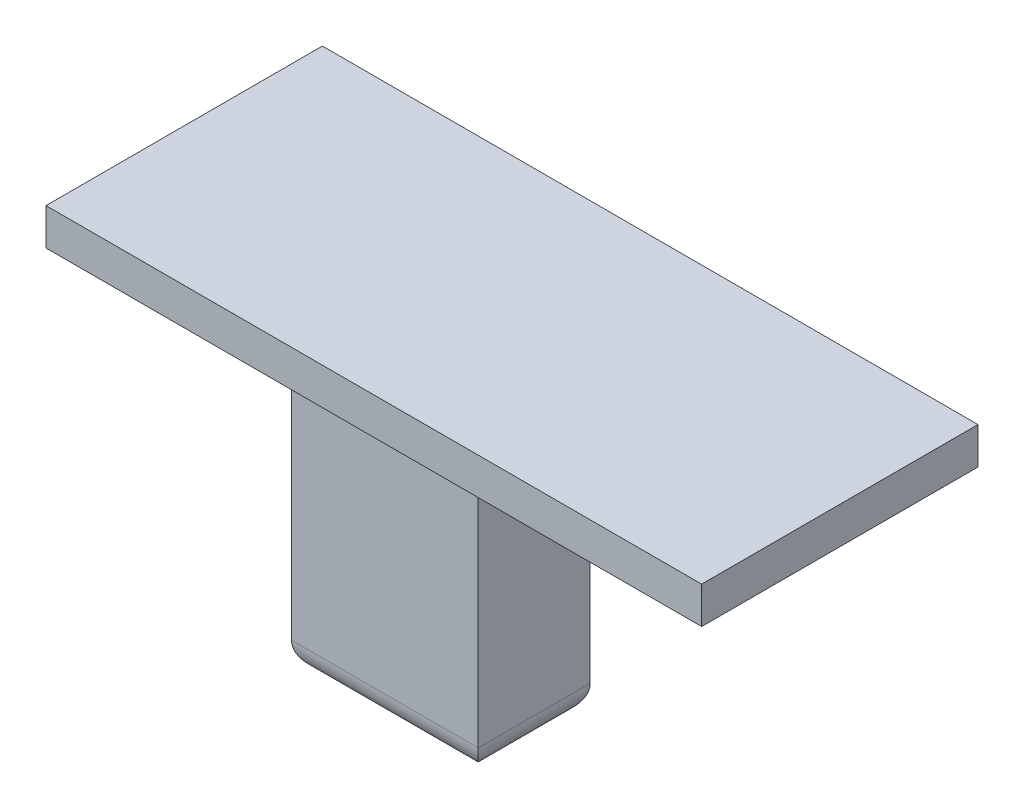
ISO-10303-21;
HEADER;
FILE_DESCRIPTION(('STEP AP214'),'2;1');
FILE_NAME('part.step','',(''),(''),'','','');
FILE_SCHEMA(('AUTOMOTIVE_DESIGN { 1 0 10303 214 1 1 1 1 }'));
ENDSEC;
DATA;
#1=APPLICATION_CONTEXT('core data for automotive mechanical design processes');
#2=APPLICATION_PROTOCOL_DEFINITION('international standard','automotive_design',2000,#1);
#3=PRODUCT_CONTEXT('',#1,'mechanical');
#4=PRODUCT('Part','Part','',(#3));
#5=PRODUCT_RELATED_PRODUCT_CATEGORY('part','',(#4));
#6=PRODUCT_DEFINITION_FORMATION('','',#4);
#7=PRODUCT_DEFINITION_CONTEXT('part definition',#1,'design');
#8=PRODUCT_DEFINITION('design','',#6,#7);
#9=PRODUCT_DEFINITION_SHAPE('','',#8);
#10=(LENGTH_UNIT() NAMED_UNIT(*) SI_UNIT(.MILLI.,.METRE.));
#11=(NAMED_UNIT(*) PLANE_ANGLE_UNIT() SI_UNIT($,.RADIAN.));
#12=(NAMED_UNIT(*) SI_UNIT($,.STERADIAN.) SOLID_ANGLE_UNIT());
#13=UNCERTAINTY_MEASURE_WITH_UNIT(LENGTH_MEASURE(1.E-05),#10,'distance_accuracy_value','');
#14=(GEOMETRIC_REPRESENTATION_CONTEXT(3) GLOBAL_UNCERTAINTY_ASSIGNED_CONTEXT((#13)) GLOBAL_UNIT_ASSIGNED_CONTEXT((#10,
#11,#12)) REPRESENTATION_CONTEXT('',''));
#15=CARTESIAN_POINT('',(0.,0.,0.));
#16=DIRECTION('',(0.,0.,1.));
#17=DIRECTION('',(1.,0.,0.));
#18=AXIS2_PLACEMENT_3D('',#15,#16,#17);
#19=CARTESIAN_POINT('',(-22.3,-2.5,-16.05));
#20=DIRECTION('',(-1.,0.,0.));
#21=DIRECTION('',(0.,0.,1.));
#22=AXIS2_PLACEMENT_3D('',#19,#20,#21);
#23=PLANE('',#22);
#24=DIRECTION('',(0.,0.,1.));
#25=VECTOR('',#24,1.);
#26=CARTESIAN_POINT('',(-22.3,0.,-16.05));
#27=LINE('',#26,#25);
#28=CARTESIAN_POINT('',(-22.3,0.,-16.05));
#29=VERTEX_POINT('',#28);
#30=CARTESIAN_POINT('',(-22.3,0.,2.75));
#31=VERTEX_POINT('',#30);
#32=EDGE_CURVE('E164',#29,#31,#27,.T.);
#33=ORIENTED_EDGE('',*,*,#32,.F.);
#34=DIRECTION('',(0.,1.,0.));
#35=VECTOR('',#34,1.);
#36=CARTESIAN_POINT('',(-22.3,-2.5,-16.05));
#37=LINE('',#36,#35);
#38=CARTESIAN_POINT('',(-22.3,-2.5,-16.05));
#39=VERTEX_POINT('',#38);
#40=EDGE_CURVE('E153',#39,#29,#37,.T.);
#41=ORIENTED_EDGE('',*,*,#40,.F.);
#42=DIRECTION('',(0.,0.,1.));
#43=VECTOR('',#42,1.);
#44=CARTESIAN_POINT('',(-22.3,-2.5,-16.05));
#45=LINE('',#44,#43);
#46=CARTESIAN_POINT('',(-22.3,-2.5,2.75));
#47=VERTEX_POINT('',#46);
#48=EDGE_CURVE('E146',#39,#47,#45,.T.);
#49=ORIENTED_EDGE('',*,*,#48,.T.);
#50=DIRECTION('',(0.,1.,0.));
#51=VECTOR('',#50,1.);
#52=CARTESIAN_POINT('',(-22.3,-2.5,2.75));
#53=LINE('',#52,#51);
#54=EDGE_CURVE('E128',#47,#31,#53,.T.);
#55=ORIENTED_EDGE('',*,*,#54,.T.);
#56=EDGE_LOOP('',(#33,#41,#49,#55));
#57=FACE_BOUND('',#56,.T.);
#58=ADVANCED_FACE('F39',(#57),#23,.T.);
#59=CARTESIAN_POINT('',(-22.3,-2.5,-16.05));
#60=DIRECTION('',(0.,0.,-1.));
#61=DIRECTION('',(-1.,0.,0.));
#62=AXIS2_PLACEMENT_3D('',#59,#60,#61);
#63=PLANE('',#62);
#64=DIRECTION('',(-1.,0.,0.));
#65=VECTOR('',#64,1.);
#66=CARTESIAN_POINT('',(-22.3,0.,-16.05));
#67=LINE('',#66,#65);
#68=CARTESIAN_POINT('',(22.3,0.,-16.05));
#69=VERTEX_POINT('',#68);
#70=EDGE_CURVE('E152',#69,#29,#67,.T.);
#71=ORIENTED_EDGE('',*,*,#70,.F.);
#72=DIRECTION('',(0.,1.,0.));
#73=VECTOR('',#72,1.);
#74=CARTESIAN_POINT('',(22.3,-2.5,-16.05));
#75=LINE('',#74,#73);
#76=CARTESIAN_POINT('',(22.3,-2.5,-16.05));
#77=VERTEX_POINT('',#76);
#78=EDGE_CURVE('E174',#77,#69,#75,.T.);
#79=ORIENTED_EDGE('',*,*,#78,.F.);
#80=DIRECTION('',(-1.,0.,0.));
#81=VECTOR('',#80,1.);
#82=CARTESIAN_POINT('',(-22.3,-2.5,-16.05));
#83=LINE('',#82,#81);
#84=EDGE_CURVE('E143',#77,#39,#83,.T.);
#85=ORIENTED_EDGE('',*,*,#84,.T.);
#86=ORIENTED_EDGE('',*,*,#40,.T.);
#87=EDGE_LOOP('',(#71,#79,#85,#86));
#88=FACE_BOUND('',#87,.T.);
#89=ADVANCED_FACE('F269',(#88),#63,.T.);
#90=CARTESIAN_POINT('',(22.3,-2.5,-16.05));
#91=DIRECTION('',(1.,0.,0.));
#92=DIRECTION('',(0.,0.,-1.));
#93=AXIS2_PLACEMENT_3D('',#90,#91,#92);
#94=PLANE('',#93);
#95=DIRECTION('',(0.,0.,-1.));
#96=VECTOR('',#95,1.);
#97=CARTESIAN_POINT('',(22.3,0.,-16.05));
#98=LINE('',#97,#96);
#99=CARTESIAN_POINT('',(22.3,0.,2.75));
#100=VERTEX_POINT('',#99);
#101=EDGE_CURVE('E160',#100,#69,#98,.T.);
#102=ORIENTED_EDGE('',*,*,#101,.F.);
#103=DIRECTION('',(0.,1.,0.));
#104=VECTOR('',#103,1.);
#105=CARTESIAN_POINT('',(22.3,-2.5,2.75));
#106=LINE('',#105,#104);
#107=CARTESIAN_POINT('',(22.3,-2.5,2.75));
#108=VERTEX_POINT('',#107);
#109=EDGE_CURVE('E137',#108,#100,#106,.T.);
#110=ORIENTED_EDGE('',*,*,#109,.F.);
#111=DIRECTION('',(0.,0.,-1.));
#112=VECTOR('',#111,1.);
#113=CARTESIAN_POINT('',(22.3,-2.5,-16.05));
#114=LINE('',#113,#112);
#115=EDGE_CURVE('E151',#108,#77,#114,.T.);
#116=ORIENTED_EDGE('',*,*,#115,.T.);
#117=ORIENTED_EDGE('',*,*,#78,.T.);
#118=EDGE_LOOP('',(#102,#110,#116,#117));
#119=FACE_BOUND('',#118,.T.);
#120=ADVANCED_FACE('F266',(#119),#94,.T.);
#121=CARTESIAN_POINT('',(-22.3,-2.5,2.75));
#122=DIRECTION('',(0.,0.,1.));
#123=DIRECTION('',(1.,0.,0.));
#124=AXIS2_PLACEMENT_3D('',#121,#122,#123);
#125=PLANE('',#124);
#126=DIRECTION('',(1.,0.,0.));
#127=VECTOR('',#126,1.);
#128=CARTESIAN_POINT('',(-22.3,0.,2.75));
#129=LINE('',#128,#127);
#130=EDGE_CURVE('E135',#31,#100,#129,.T.);
#131=ORIENTED_EDGE('',*,*,#130,.F.);
#132=ORIENTED_EDGE('',*,*,#54,.F.);
#133=DIRECTION('',(1.,0.,0.));
#134=VECTOR('',#133,1.);
#135=CARTESIAN_POINT('',(-22.3,-2.5,2.75));
#136=LINE('',#135,#134);
#137=EDGE_CURVE('E134',#47,#108,#136,.T.);
#138=ORIENTED_EDGE('',*,*,#137,.T.);
#139=ORIENTED_EDGE('',*,*,#109,.T.);
#140=EDGE_LOOP('',(#131,#132,#138,#139));
#141=FACE_BOUND('',#140,.T.);
#142=ADVANCED_FACE('F132',(#141),#125,.T.);
#143=CARTESIAN_POINT('',(0.,-2.5,0.));
#144=DIRECTION('',(0.,1.,0.));
#145=DIRECTION('',(0.,0.,1.));
#146=AXIS2_PLACEMENT_3D('',#143,#144,#145);
#147=PLANE('',#146);
#148=DIRECTION('',(-1.,0.,0.));
#149=VECTOR('',#148,1.);
#150=CARTESIAN_POINT('',(0.,-2.5,-6.12));
#151=LINE('',#150,#149);
#152=CARTESIAN_POINT('',(6.85,-2.5,-6.12));
#153=VERTEX_POINT('',#152);
#154=CARTESIAN_POINT('',(-6.85,-2.5,-6.12));
#155=VERTEX_POINT('',#154);
#156=EDGE_CURVE('E202',#153,#155,#151,.T.);
#157=ORIENTED_EDGE('',*,*,#156,.T.);
#158=DIRECTION('',(0.,0.,1.));
#159=VECTOR('',#158,1.);
#160=CARTESIAN_POINT('',(-6.85,-2.5,0.));
#161=LINE('',#160,#159);
#162=CARTESIAN_POINT('',(-6.85,-2.5,2.5));
#163=VERTEX_POINT('',#162);
#164=EDGE_CURVE('E207',#155,#163,#161,.T.);
#165=ORIENTED_EDGE('',*,*,#164,.T.);
#166=DIRECTION('',(1.,0.,0.));
#167=VECTOR('',#166,1.);
#168=CARTESIAN_POINT('',(0.,-2.5,2.5));
#169=LINE('',#168,#167);
#170=CARTESIAN_POINT('',(6.85,-2.5,2.5));
#171=VERTEX_POINT('',#170);
#172=EDGE_CURVE('E210',#163,#171,#169,.T.);
#173=ORIENTED_EDGE('',*,*,#172,.T.);
#174=DIRECTION('',(0.,0.,-1.));
#175=VECTOR('',#174,1.);
#176=CARTESIAN_POINT('',(6.85,-2.5,0.));
#177=LINE('',#176,#175);
#178=EDGE_CURVE('E191',#171,#153,#177,.T.);
#179=ORIENTED_EDGE('',*,*,#178,.T.);
#180=EDGE_LOOP('',(#157,#165,#173,#179));
#181=FACE_BOUND('',#180,.T.);
#182=ORIENTED_EDGE('',*,*,#48,.F.);
#183=ORIENTED_EDGE('',*,*,#84,.F.);
#184=ORIENTED_EDGE('',*,*,#115,.F.);
#185=ORIENTED_EDGE('',*,*,#137,.F.);
#186=EDGE_LOOP('',(#182,#183,#184,#185));
#187=FACE_BOUND('',#186,.T.);
#188=ADVANCED_FACE('F148',(#181,#187),#147,.F.);
#189=CARTESIAN_POINT('',(0.,0.,0.));
#190=DIRECTION('',(0.,1.,0.));
#191=DIRECTION('',(0.,0.,1.));
#192=AXIS2_PLACEMENT_3D('',#189,#190,#191);
#193=PLANE('',#192);
#194=ORIENTED_EDGE('',*,*,#32,.T.);
#195=ORIENTED_EDGE('',*,*,#130,.T.);
#196=ORIENTED_EDGE('',*,*,#101,.T.);
#197=ORIENTED_EDGE('',*,*,#70,.T.);
#198=EDGE_LOOP('',(#194,#195,#196,#197));
#199=FACE_BOUND('',#198,.T.);
#200=ADVANCED_FACE('F254',(#199),#193,.T.);
#201=CARTESIAN_POINT('',(6.35,-20.,2.));
#202=DIRECTION('',(1.,0.,0.));
#203=DIRECTION('',(0.,0.,-1.));
#204=AXIS2_PLACEMENT_3D('',#201,#202,#203);
#205=PLANE('',#204);
#206=DIRECTION('',(0.,1.,0.));
#207=VECTOR('',#206,1.);
#208=CARTESIAN_POINT('',(6.35,-20.,-5.62));
#209=LINE('',#208,#207);
#210=CARTESIAN_POINT('',(6.35,-18.,-5.62));
#211=VERTEX_POINT('',#210);
#212=CARTESIAN_POINT('',(6.35,-3.,-5.62));
#213=VERTEX_POINT('',#212);
#214=EDGE_CURVE('E159',#211,#213,#209,.T.);
#215=ORIENTED_EDGE('',*,*,#214,.T.);
#216=DIRECTION('',(0.,0.,-1.));
#217=VECTOR('',#216,1.);
#218=CARTESIAN_POINT('',(6.35,-3.,2.));
#219=LINE('',#218,#217);
#220=CARTESIAN_POINT('',(6.35,-3.,2.));
#221=VERTEX_POINT('',#220);
#222=EDGE_CURVE('E11',#213,#221,#219,.F.);
#223=ORIENTED_EDGE('',*,*,#222,.T.);
#224=DIRECTION('',(0.,1.,0.));
#225=VECTOR('',#224,1.);
#226=CARTESIAN_POINT('',(6.35,-20.,2.));
#227=LINE('',#226,#225);
#228=CARTESIAN_POINT('',(6.35,-18.,2.));
#229=VERTEX_POINT('',#228);
#230=EDGE_CURVE('E170',#229,#221,#227,.T.);
#231=ORIENTED_EDGE('',*,*,#230,.F.);
#232=DIRECTION('',(0.,0.,-1.));
#233=VECTOR('',#232,1.);
#234=CARTESIAN_POINT('',(6.35,-18.,-5.62));
#235=LINE('',#234,#233);
#236=EDGE_CURVE('E193',#229,#211,#235,.T.);
#237=ORIENTED_EDGE('',*,*,#236,.T.);
#238=EDGE_LOOP('',(#215,#223,#231,#237));
#239=FACE_BOUND('',#238,.T.);
#240=ADVANCED_FACE('F265',(#239),#205,.T.);
#241=CARTESIAN_POINT('',(6.35,-20.,2.));
#242=DIRECTION('',(0.,0.,1.));
#243=DIRECTION('',(1.,0.,0.));
#244=AXIS2_PLACEMENT_3D('',#241,#242,#243);
#245=PLANE('',#244);
#246=ORIENTED_EDGE('',*,*,#230,.T.);
#247=DIRECTION('',(1.,0.,0.));
#248=VECTOR('',#247,1.);
#249=CARTESIAN_POINT('',(6.35,-3.,2.));
#250=LINE('',#249,#248);
#251=CARTESIAN_POINT('',(-6.35,-3.,2.));
#252=VERTEX_POINT('',#251);
#253=EDGE_CURVE('E214',#221,#252,#250,.F.);
#254=ORIENTED_EDGE('',*,*,#253,.T.);
#255=DIRECTION('',(0.,1.,0.));
#256=VECTOR('',#255,1.);
#257=CARTESIAN_POINT('',(-6.35,-20.,2.));
#258=LINE('',#257,#256);
#259=CARTESIAN_POINT('',(-6.35,-18.,2.));
#260=VERTEX_POINT('',#259);
#261=EDGE_CURVE('E241',#260,#252,#258,.T.);
#262=ORIENTED_EDGE('',*,*,#261,.F.);
#263=DIRECTION('',(1.,0.,0.));
#264=VECTOR('',#263,1.);
#265=CARTESIAN_POINT('',(6.35,-18.,2.));
#266=LINE('',#265,#264);
#267=EDGE_CURVE('E188',#260,#229,#266,.T.);
#268=ORIENTED_EDGE('',*,*,#267,.T.);
#269=EDGE_LOOP('',(#246,#254,#262,#268));
#270=FACE_BOUND('',#269,.T.);
#271=ADVANCED_FACE('F238',(#270),#245,.T.);
#272=CARTESIAN_POINT('',(-6.35,-20.,2.));
#273=DIRECTION('',(-1.,0.,0.));
#274=DIRECTION('',(0.,0.,1.));
#275=AXIS2_PLACEMENT_3D('',#272,#273,#274);
#276=PLANE('',#275);
#277=ORIENTED_EDGE('',*,*,#261,.T.);
#278=DIRECTION('',(0.,0.,1.));
#279=VECTOR('',#278,1.);
#280=CARTESIAN_POINT('',(-6.35,-3.,2.));
#281=LINE('',#280,#279);
#282=CARTESIAN_POINT('',(-6.35,-3.,-5.62));
#283=VERTEX_POINT('',#282);
#284=EDGE_CURVE('E215',#252,#283,#281,.F.);
#285=ORIENTED_EDGE('',*,*,#284,.T.);
#286=DIRECTION('',(0.,1.,0.));
#287=VECTOR('',#286,1.);
#288=CARTESIAN_POINT('',(-6.35,-20.,-5.62));
#289=LINE('',#288,#287);
#290=CARTESIAN_POINT('',(-6.35,-18.,-5.62));
#291=VERTEX_POINT('',#290);
#292=EDGE_CURVE('E246',#291,#283,#289,.T.);
#293=ORIENTED_EDGE('',*,*,#292,.F.);
#294=DIRECTION('',(0.,0.,1.));
#295=VECTOR('',#294,1.);
#296=CARTESIAN_POINT('',(-6.35,-18.,2.));
#297=LINE('',#296,#295);
#298=EDGE_CURVE('E187',#291,#260,#297,.T.);
#299=ORIENTED_EDGE('',*,*,#298,.T.);
#300=EDGE_LOOP('',(#277,#285,#293,#299));
#301=FACE_BOUND('',#300,.T.);
#302=ADVANCED_FACE('F245',(#301),#276,.T.);
#303=CARTESIAN_POINT('',(6.35,-20.,-5.62));
#304=DIRECTION('',(0.,0.,-1.));
#305=DIRECTION('',(-1.,0.,0.));
#306=AXIS2_PLACEMENT_3D('',#303,#304,#305);
#307=PLANE('',#306);
#308=ORIENTED_EDGE('',*,*,#292,.T.);
#309=DIRECTION('',(-1.,0.,0.));
#310=VECTOR('',#309,1.);
#311=CARTESIAN_POINT('',(6.35,-3.,-5.62));
#312=LINE('',#311,#310);
#313=EDGE_CURVE('E48',#283,#213,#312,.F.);
#314=ORIENTED_EDGE('',*,*,#313,.T.);
#315=ORIENTED_EDGE('',*,*,#214,.F.);
#316=DIRECTION('',(-1.,0.,0.));
#317=VECTOR('',#316,1.);
#318=CARTESIAN_POINT('',(-6.35,-18.,-5.62));
#319=LINE('',#318,#317);
#320=EDGE_CURVE('E172',#211,#291,#319,.T.);
#321=ORIENTED_EDGE('',*,*,#320,.T.);
#322=EDGE_LOOP('',(#308,#314,#315,#321));
#323=FACE_BOUND('',#322,.T.);
#324=ADVANCED_FACE('F310',(#323),#307,.T.);
#325=CARTESIAN_POINT('',(0.,-20.,0.));
#326=DIRECTION('',(0.,1.,0.));
#327=DIRECTION('',(0.,0.,1.));
#328=AXIS2_PLACEMENT_3D('',#325,#326,#327);
#329=PLANE('',#328);
#330=DIRECTION('',(0.,0.,1.));
#331=VECTOR('',#330,1.);
#332=CARTESIAN_POINT('',(-4.35,-20.,-5.62));
#333=LINE('',#332,#331);
#334=CARTESIAN_POINT('',(-4.35,-20.,0.));
#335=VERTEX_POINT('',#334);
#336=CARTESIAN_POINT('',(-4.35,-20.,-3.62));
#337=VERTEX_POINT('',#336);
#338=EDGE_CURVE('E185',#335,#337,#333,.F.);
#339=ORIENTED_EDGE('',*,*,#338,.T.);
#340=DIRECTION('',(-1.,0.,0.));
#341=VECTOR('',#340,1.);
#342=CARTESIAN_POINT('',(6.35,-20.,-3.62));
#343=LINE('',#342,#341);
#344=CARTESIAN_POINT('',(4.35,-20.,-3.62));
#345=VERTEX_POINT('',#344);
#346=EDGE_CURVE('E184',#337,#345,#343,.F.);
#347=ORIENTED_EDGE('',*,*,#346,.T.);
#348=DIRECTION('',(0.,0.,-1.));
#349=VECTOR('',#348,1.);
#350=CARTESIAN_POINT('',(4.35,-20.,2.));
#351=LINE('',#350,#349);
#352=CARTESIAN_POINT('',(4.35,-20.,0.));
#353=VERTEX_POINT('',#352);
#354=EDGE_CURVE('E176',#345,#353,#351,.F.);
#355=ORIENTED_EDGE('',*,*,#354,.T.);
#356=DIRECTION('',(1.,0.,0.));
#357=VECTOR('',#356,1.);
#358=CARTESIAN_POINT('',(-6.35,-20.,0.));
#359=LINE('',#358,#357);
#360=EDGE_CURVE('E177',#353,#335,#359,.F.);
#361=ORIENTED_EDGE('',*,*,#360,.T.);
#362=EDGE_LOOP('',(#339,#347,#355,#361));
#363=FACE_BOUND('',#362,.T.);
#364=ADVANCED_FACE('F291',(#363),#329,.F.);
#365=CARTESIAN_POINT('',(6.35,-18.,0.));
#366=DIRECTION('',(-1.,0.,0.));
#367=DIRECTION('',(0.,0.,1.));
#368=AXIS2_PLACEMENT_3D('',#365,#366,#367);
#369=CYLINDRICAL_SURFACE('',#368,2.);
#370=CARTESIAN_POINT('',(-4.35,-18.,0.));
#371=DIRECTION('',(-0.707106781186547,0.,-0.707106781186547));
#372=DIRECTION('',(-0.707106781186547,0.,0.707106781186547));
#373=AXIS2_PLACEMENT_3D('',#370,#371,#372);
#374=ELLIPSE('',#373,2.82842712474619,2.);
#375=EDGE_CURVE('E196',#335,#260,#374,.T.);
#376=ORIENTED_EDGE('',*,*,#375,.F.);
#377=ORIENTED_EDGE('',*,*,#360,.F.);
#378=CARTESIAN_POINT('',(4.35,-18.,0.));
#379=DIRECTION('',(-0.707106781186547,0.,0.707106781186548));
#380=DIRECTION('',(0.707106781186548,0.,0.707106781186547));
#381=AXIS2_PLACEMENT_3D('',#378,#379,#380);
#382=ELLIPSE('',#381,2.82842712474619,2.);
#383=EDGE_CURVE('E203',#229,#353,#382,.F.);
#384=ORIENTED_EDGE('',*,*,#383,.F.);
#385=ORIENTED_EDGE('',*,*,#267,.F.);
#386=EDGE_LOOP('',(#376,#377,#384,#385));
#387=FACE_BOUND('',#386,.T.);
#388=ADVANCED_FACE('F289',(#387),#369,.T.);
#389=CARTESIAN_POINT('',(4.35,-18.,2.));
#390=DIRECTION('',(0.,0.,1.));
#391=DIRECTION('',(1.,0.,0.));
#392=AXIS2_PLACEMENT_3D('',#389,#390,#391);
#393=CYLINDRICAL_SURFACE('',#392,2.);
#394=ORIENTED_EDGE('',*,*,#383,.T.);
#395=ORIENTED_EDGE('',*,*,#354,.F.);
#396=CARTESIAN_POINT('',(4.35,-18.,-3.62));
#397=DIRECTION('',(0.707106781186548,0.,0.707106781186547));
#398=DIRECTION('',(-0.707106781186547,0.,0.707106781186548));
#399=AXIS2_PLACEMENT_3D('',#396,#397,#398);
#400=ELLIPSE('',#399,2.82842712474619,2.);
#401=EDGE_CURVE('E198',#211,#345,#400,.F.);
#402=ORIENTED_EDGE('',*,*,#401,.F.);
#403=ORIENTED_EDGE('',*,*,#236,.F.);
#404=EDGE_LOOP('',(#394,#395,#402,#403));
#405=FACE_BOUND('',#404,.T.);
#406=ADVANCED_FACE('F285',(#405),#393,.T.);
#407=CARTESIAN_POINT('',(-4.35,-18.,2.));
#408=DIRECTION('',(0.,0.,-1.));
#409=DIRECTION('',(-1.,0.,0.));
#410=AXIS2_PLACEMENT_3D('',#407,#408,#409);
#411=CYLINDRICAL_SURFACE('',#410,2.);
#412=ORIENTED_EDGE('',*,*,#375,.T.);
#413=ORIENTED_EDGE('',*,*,#298,.F.);
#414=CARTESIAN_POINT('',(-4.35,-18.,-3.62));
#415=DIRECTION('',(0.707106781186547,0.,-0.707106781186547));
#416=DIRECTION('',(-0.707106781186547,0.,-0.707106781186547));
#417=AXIS2_PLACEMENT_3D('',#414,#415,#416);
#418=ELLIPSE('',#417,2.82842712474619,2.);
#419=EDGE_CURVE('E194',#337,#291,#418,.T.);
#420=ORIENTED_EDGE('',*,*,#419,.F.);
#421=ORIENTED_EDGE('',*,*,#338,.F.);
#422=EDGE_LOOP('',(#412,#413,#420,#421));
#423=FACE_BOUND('',#422,.T.);
#424=ADVANCED_FACE('F281',(#423),#411,.T.);
#425=CARTESIAN_POINT('',(6.35,-18.,-3.62));
#426=DIRECTION('',(1.,0.,0.));
#427=DIRECTION('',(0.,0.,-1.));
#428=AXIS2_PLACEMENT_3D('',#425,#426,#427);
#429=CYLINDRICAL_SURFACE('',#428,2.);
#430=ORIENTED_EDGE('',*,*,#401,.T.);
#431=ORIENTED_EDGE('',*,*,#346,.F.);
#432=ORIENTED_EDGE('',*,*,#419,.T.);
#433=ORIENTED_EDGE('',*,*,#320,.F.);
#434=EDGE_LOOP('',(#430,#431,#432,#433));
#435=FACE_BOUND('',#434,.T.);
#436=ADVANCED_FACE('F276',(#435),#429,.T.);
#437=CARTESIAN_POINT('',(6.85,-3.,0.));
#438=DIRECTION('',(0.,0.,-1.));
#439=DIRECTION('',(-1.,0.,0.));
#440=AXIS2_PLACEMENT_3D('',#437,#438,#439);
#441=CYLINDRICAL_SURFACE('',#440,0.5);
#442=CARTESIAN_POINT('',(6.85,-3.,2.5));
#443=DIRECTION('',(0.707106781186547,0.,-0.707106781186548));
#444=DIRECTION('',(-0.707106781186548,0.,-0.707106781186547));
#445=AXIS2_PLACEMENT_3D('',#442,#443,#444);
#446=ELLIPSE('',#445,0.707106781186547,0.5);
#447=EDGE_CURVE('E222',#221,#171,#446,.T.);
#448=ORIENTED_EDGE('',*,*,#447,.F.);
#449=ORIENTED_EDGE('',*,*,#222,.F.);
#450=CARTESIAN_POINT('',(6.85,-3.,-6.12));
#451=DIRECTION('',(-0.707106781186548,0.,-0.707106781186547));
#452=DIRECTION('',(0.707106781186547,0.,-0.707106781186548));
#453=AXIS2_PLACEMENT_3D('',#450,#451,#452);
#454=ELLIPSE('',#453,0.707106781186548,0.5);
#455=EDGE_CURVE('E43',#153,#213,#454,.F.);
#456=ORIENTED_EDGE('',*,*,#455,.F.);
#457=ORIENTED_EDGE('',*,*,#178,.F.);
#458=EDGE_LOOP('',(#448,#449,#456,#457));
#459=FACE_BOUND('',#458,.T.);
#460=ADVANCED_FACE('F41',(#459),#441,.F.);
#461=CARTESIAN_POINT('',(0.,-3.,-6.12));
#462=DIRECTION('',(-1.,0.,0.));
#463=DIRECTION('',(0.,0.,1.));
#464=AXIS2_PLACEMENT_3D('',#461,#462,#463);
#465=CYLINDRICAL_SURFACE('',#464,0.5);
#466=ORIENTED_EDGE('',*,*,#455,.T.);
#467=ORIENTED_EDGE('',*,*,#313,.F.);
#468=CARTESIAN_POINT('',(-6.85,-3.,-6.12));
#469=DIRECTION('',(-0.707106781186547,0.,0.707106781186547));
#470=DIRECTION('',(-0.707106781186547,0.,-0.707106781186547));
#471=AXIS2_PLACEMENT_3D('',#468,#469,#470);
#472=ELLIPSE('',#471,0.707106781186547,0.5);
#473=EDGE_CURVE('E219',#155,#283,#472,.F.);
#474=ORIENTED_EDGE('',*,*,#473,.F.);
#475=ORIENTED_EDGE('',*,*,#156,.F.);
#476=EDGE_LOOP('',(#466,#467,#474,#475));
#477=FACE_BOUND('',#476,.T.);
#478=ADVANCED_FACE('F233',(#477),#465,.F.);
#479=CARTESIAN_POINT('',(0.,-3.,2.5));
#480=DIRECTION('',(1.,0.,0.));
#481=DIRECTION('',(0.,0.,-1.));
#482=AXIS2_PLACEMENT_3D('',#479,#480,#481);
#483=CYLINDRICAL_SURFACE('',#482,0.5);
#484=ORIENTED_EDGE('',*,*,#447,.T.);
#485=ORIENTED_EDGE('',*,*,#172,.F.);
#486=CARTESIAN_POINT('',(-6.85,-3.,2.5));
#487=DIRECTION('',(0.707106781186547,0.,0.707106781186547));
#488=DIRECTION('',(0.707106781186547,0.,-0.707106781186547));
#489=AXIS2_PLACEMENT_3D('',#486,#487,#488);
#490=ELLIPSE('',#489,0.707106781186548,0.5);
#491=EDGE_CURVE('E217',#252,#163,#490,.T.);
#492=ORIENTED_EDGE('',*,*,#491,.F.);
#493=ORIENTED_EDGE('',*,*,#253,.F.);
#494=EDGE_LOOP('',(#484,#485,#492,#493));
#495=FACE_BOUND('',#494,.T.);
#496=ADVANCED_FACE('F237',(#495),#483,.F.);
#497=CARTESIAN_POINT('',(-6.85,-3.,0.));
#498=DIRECTION('',(0.,0.,1.));
#499=DIRECTION('',(1.,0.,0.));
#500=AXIS2_PLACEMENT_3D('',#497,#498,#499);
#501=CYLINDRICAL_SURFACE('',#500,0.5);
#502=ORIENTED_EDGE('',*,*,#473,.T.);
#503=ORIENTED_EDGE('',*,*,#284,.F.);
#504=ORIENTED_EDGE('',*,*,#491,.T.);
#505=ORIENTED_EDGE('',*,*,#164,.F.);
#506=EDGE_LOOP('',(#502,#503,#504,#505));
#507=FACE_BOUND('',#506,.T.);
#508=ADVANCED_FACE('F253',(#507),#501,.F.);
#509=CLOSED_SHELL('',(#58,#89,#120,#142,#188,#200,#240,#271,#302,#324,#364,#388,#406,#424,#436,
#460,#478,#496,#508));
#510=MANIFOLD_SOLID_BREP('B2',#509);
#511=ADVANCED_BREP_SHAPE_REPRESENTATION('',(#18,#510),#14);
#512=SHAPE_DEFINITION_REPRESENTATION(#9,#511);
ENDSEC;
END-ISO-10303-21;
